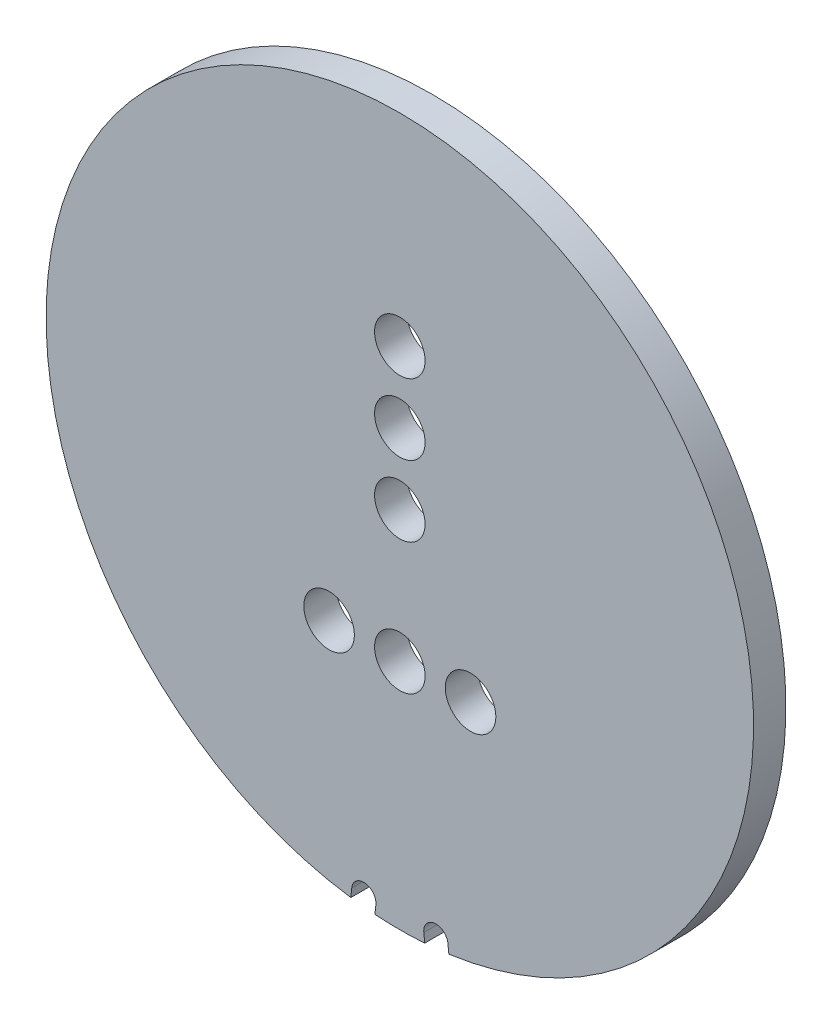
ISO-10303-21;
HEADER;
FILE_DESCRIPTION(('STEP AP214'),'2;1');
FILE_NAME('part.step','',(''),(''),'','','');
FILE_SCHEMA(('AUTOMOTIVE_DESIGN { 1 0 10303 214 1 1 1 1 }'));
ENDSEC;
DATA;
#1=APPLICATION_CONTEXT('core data for automotive mechanical design processes');
#2=APPLICATION_PROTOCOL_DEFINITION('international standard','automotive_design',2000,#1);
#3=PRODUCT_CONTEXT('',#1,'mechanical');
#4=PRODUCT('Part','Part','',(#3));
#5=PRODUCT_RELATED_PRODUCT_CATEGORY('part','',(#4));
#6=PRODUCT_DEFINITION_FORMATION('','',#4);
#7=PRODUCT_DEFINITION_CONTEXT('part definition',#1,'design');
#8=PRODUCT_DEFINITION('design','',#6,#7);
#9=PRODUCT_DEFINITION_SHAPE('','',#8);
#10=(LENGTH_UNIT() NAMED_UNIT(*) SI_UNIT(.MILLI.,.METRE.));
#11=(NAMED_UNIT(*) PLANE_ANGLE_UNIT() SI_UNIT($,.RADIAN.));
#12=(NAMED_UNIT(*) SI_UNIT($,.STERADIAN.) SOLID_ANGLE_UNIT());
#13=UNCERTAINTY_MEASURE_WITH_UNIT(LENGTH_MEASURE(1.E-05),#10,'distance_accuracy_value','');
#14=(GEOMETRIC_REPRESENTATION_CONTEXT(3) GLOBAL_UNCERTAINTY_ASSIGNED_CONTEXT((#13)) GLOBAL_UNIT_ASSIGNED_CONTEXT((#10,
#11,#12)) REPRESENTATION_CONTEXT('',''));
#15=CARTESIAN_POINT('',(0.,0.,0.));
#16=DIRECTION('',(0.,0.,1.));
#17=DIRECTION('',(1.,0.,0.));
#18=AXIS2_PLACEMENT_3D('',#15,#16,#17);
#19=CARTESIAN_POINT('',(0.,0.,-932.));
#20=DIRECTION('',(0.,0.,1.));
#21=DIRECTION('',(1.,0.,0.));
#22=AXIS2_PLACEMENT_3D('',#19,#20,#21);
#23=CYLINDRICAL_SURFACE('',#22,17.5);
#24=DIRECTION('',(0.,0.,-1.));
#25=VECTOR('',#24,1.);
#26=CARTESIAN_POINT('',(2.42488577834874,-17.3311837149677,-930.4));
#27=LINE('',#26,#25);
#28=CARTESIAN_POINT('',(2.42488577834874,-17.3311837149677,-930.4));
#29=VERTEX_POINT('',#28);
#30=CARTESIAN_POINT('',(2.42488577834874,-17.3311837149677,-932.));
#31=VERTEX_POINT('',#30);
#32=EDGE_CURVE('E59',#29,#31,#27,.T.);
#33=ORIENTED_EDGE('',*,*,#32,.T.);
#34=CARTESIAN_POINT('',(0.,0.,-932.));
#35=DIRECTION('',(0.,0.,-1.));
#36=DIRECTION('',(-1.,0.,0.));
#37=AXIS2_PLACEMENT_3D('',#34,#35,#36);
#38=CIRCLE('',#37,17.5);
#39=CARTESIAN_POINT('',(-2.42488577834874,-17.3311837149677,-932.));
#40=VERTEX_POINT('',#39);
#41=EDGE_CURVE('E44',#40,#31,#38,.T.);
#42=ORIENTED_EDGE('',*,*,#41,.F.);
#43=DIRECTION('',(0.,0.,-1.));
#44=VECTOR('',#43,1.);
#45=CARTESIAN_POINT('',(-2.42488577834874,-17.3311837149677,-930.4));
#46=LINE('',#45,#44);
#47=CARTESIAN_POINT('',(-2.42488577834874,-17.3311837149677,-930.4));
#48=VERTEX_POINT('',#47);
#49=EDGE_CURVE('E132',#48,#40,#46,.T.);
#50=ORIENTED_EDGE('',*,*,#49,.F.);
#51=CARTESIAN_POINT('',(0.,0.,-930.4));
#52=DIRECTION('',(0.,0.,-1.));
#53=DIRECTION('',(-1.,0.,0.));
#54=AXIS2_PLACEMENT_3D('',#51,#52,#53);
#55=CIRCLE('',#54,17.5);
#56=EDGE_CURVE('E39',#48,#29,#55,.T.);
#57=ORIENTED_EDGE('',*,*,#56,.T.);
#58=EDGE_LOOP('',(#33,#42,#50,#57));
#59=FACE_BOUND('',#58,.T.);
#60=ADVANCED_FACE('F35',(#59),#23,.T.);
#61=CARTESIAN_POINT('',(1.23145950390682,-17.4566178708889,-932.));
#62=VERTEX_POINT('',#61);
#63=CARTESIAN_POINT('',(-1.23145950390682,-17.4566178708889,-932.));
#64=VERTEX_POINT('',#63);
#65=EDGE_CURVE('E11',#62,#64,#38,.T.);
#66=ORIENTED_EDGE('',*,*,#65,.F.);
#67=DIRECTION('',(0.,0.,-1.));
#68=VECTOR('',#67,1.);
#69=CARTESIAN_POINT('',(1.23145950390682,-17.4566178708889,-930.4));
#70=LINE('',#69,#68);
#71=CARTESIAN_POINT('',(1.23145950390682,-17.4566178708889,-930.4));
#72=VERTEX_POINT('',#71);
#73=EDGE_CURVE('E136',#72,#62,#70,.T.);
#74=ORIENTED_EDGE('',*,*,#73,.F.);
#75=CARTESIAN_POINT('',(-1.23145950390682,-17.4566178708889,-930.4));
#76=VERTEX_POINT('',#75);
#77=EDGE_CURVE('E163',#72,#76,#55,.T.);
#78=ORIENTED_EDGE('',*,*,#77,.T.);
#79=DIRECTION('',(0.,0.,-1.));
#80=VECTOR('',#79,1.);
#81=CARTESIAN_POINT('',(-1.23145950390682,-17.4566178708889,-930.4));
#82=LINE('',#81,#80);
#83=EDGE_CURVE('E158',#76,#64,#82,.T.);
#84=ORIENTED_EDGE('',*,*,#83,.T.);
#85=EDGE_LOOP('',(#66,#74,#78,#84));
#86=FACE_BOUND('',#85,.T.);
#87=ADVANCED_FACE('F37',(#86),#23,.T.);
#88=CARTESIAN_POINT('',(0.,0.,-932.));
#89=DIRECTION('',(0.,0.,-1.));
#90=DIRECTION('',(-1.,0.,0.));
#91=AXIS2_PLACEMENT_3D('',#88,#89,#90);
#92=PLANE('',#91);
#93=CARTESIAN_POINT('',(0.,7.5,-932.));
#94=DIRECTION('',(0.,0.,1.));
#95=DIRECTION('',(1.,0.,0.));
#96=AXIS2_PLACEMENT_3D('',#93,#94,#95);
#97=CIRCLE('',#96,1.25);
#98=CARTESIAN_POINT('',(1.25,7.5,-932.));
#99=VERTEX_POINT('',#98);
#100=EDGE_CURVE('E153',#99,#99,#97,.T.);
#101=ORIENTED_EDGE('',*,*,#100,.T.);
#102=EDGE_LOOP('',(#101));
#103=FACE_BOUND('',#102,.T.);
#104=CARTESIAN_POINT('',(0.,4.,-932.));
#105=DIRECTION('',(0.,0.,1.));
#106=DIRECTION('',(1.,0.,0.));
#107=AXIS2_PLACEMENT_3D('',#104,#105,#106);
#108=CIRCLE('',#107,1.25);
#109=CARTESIAN_POINT('',(1.24999999999999,4.,-932.));
#110=VERTEX_POINT('',#109);
#111=EDGE_CURVE('E241',#110,#110,#108,.T.);
#112=ORIENTED_EDGE('',*,*,#111,.T.);
#113=EDGE_LOOP('',(#112));
#114=FACE_BOUND('',#113,.T.);
#115=CARTESIAN_POINT('',(0.,0.5,-932.));
#116=DIRECTION('',(0.,0.,1.));
#117=DIRECTION('',(1.,0.,0.));
#118=AXIS2_PLACEMENT_3D('',#115,#116,#117);
#119=CIRCLE('',#118,1.25);
#120=CARTESIAN_POINT('',(1.25,0.5,-932.));
#121=VERTEX_POINT('',#120);
#122=EDGE_CURVE('E250',#121,#121,#119,.T.);
#123=ORIENTED_EDGE('',*,*,#122,.T.);
#124=EDGE_LOOP('',(#123));
#125=FACE_BOUND('',#124,.T.);
#126=CARTESIAN_POINT('',(-3.5,-5.99999999999999,-932.));
#127=DIRECTION('',(0.,0.,1.));
#128=DIRECTION('',(1.,0.,0.));
#129=AXIS2_PLACEMENT_3D('',#126,#127,#128);
#130=CIRCLE('',#129,1.25);
#131=CARTESIAN_POINT('',(-2.25,-5.99999999999999,-932.));
#132=VERTEX_POINT('',#131);
#133=EDGE_CURVE('E256',#132,#132,#130,.T.);
#134=ORIENTED_EDGE('',*,*,#133,.T.);
#135=EDGE_LOOP('',(#134));
#136=FACE_BOUND('',#135,.T.);
#137=CARTESIAN_POINT('',(0.,-5.99999999999998,-932.));
#138=DIRECTION('',(0.,0.,1.));
#139=DIRECTION('',(1.,0.,0.));
#140=AXIS2_PLACEMENT_3D('',#137,#138,#139);
#141=CIRCLE('',#140,1.25);
#142=CARTESIAN_POINT('',(1.25,-5.99999999999998,-932.));
#143=VERTEX_POINT('',#142);
#144=EDGE_CURVE('E262',#143,#143,#141,.T.);
#145=ORIENTED_EDGE('',*,*,#144,.T.);
#146=EDGE_LOOP('',(#145));
#147=FACE_BOUND('',#146,.T.);
#148=CARTESIAN_POINT('',(3.5,-5.99999999999999,-932.));
#149=DIRECTION('',(0.,0.,1.));
#150=DIRECTION('',(1.,0.,0.));
#151=AXIS2_PLACEMENT_3D('',#148,#149,#150);
#152=CIRCLE('',#151,1.25);
#153=CARTESIAN_POINT('',(4.75,-5.99999999999999,-932.));
#154=VERTEX_POINT('',#153);
#155=EDGE_CURVE('E267',#154,#154,#152,.T.);
#156=ORIENTED_EDGE('',*,*,#155,.T.);
#157=EDGE_LOOP('',(#156));
#158=FACE_BOUND('',#157,.T.);
#159=DIRECTION('',(-0.104528463267653,0.994521895368273,0.));
#160=VECTOR('',#159,1.);
#161=CARTESIAN_POINT('',(-0.596713137220949,-0.0627170779605902,-932.));
#162=LINE('',#161,#160);
#163=CARTESIAN_POINT('',(1.18549716149254,-17.0193153939897,-932.));
#164=VERTEX_POINT('',#163);
#165=EDGE_CURVE('E121',#62,#164,#162,.T.);
#166=ORIENTED_EDGE('',*,*,#165,.F.);
#167=ORIENTED_EDGE('',*,*,#65,.T.);
#168=DIRECTION('',(0.104528463267653,0.994521895368273,0.));
#169=VECTOR('',#168,1.);
#170=CARTESIAN_POINT('',(0.596713137220949,-0.0627170779605902,-932.));
#171=LINE('',#170,#169);
#172=CARTESIAN_POINT('',(-1.18549716149254,-17.0193153939897,-932.));
#173=VERTEX_POINT('',#172);
#174=EDGE_CURVE('E143',#64,#173,#171,.T.);
#175=ORIENTED_EDGE('',*,*,#174,.T.);
#176=CARTESIAN_POINT('',(-1.7822102987135,-16.9565983160291,-932.));
#177=DIRECTION('',(0.,0.,-1.));
#178=DIRECTION('',(-1.,0.,0.));
#179=AXIS2_PLACEMENT_3D('',#176,#177,#178);
#180=CIRCLE('',#179,0.599999999999996);
#181=CARTESIAN_POINT('',(-2.37892343593446,-16.8938812380685,-932.));
#182=VERTEX_POINT('',#181);
#183=EDGE_CURVE('E152',#182,#173,#180,.T.);
#184=ORIENTED_EDGE('',*,*,#183,.F.);
#185=DIRECTION('',(0.104528463267654,0.994521895368273,0.));
#186=VECTOR('',#185,1.);
#187=CARTESIAN_POINT('',(-0.596713137220963,0.062717077960592,-932.));
#188=LINE('',#187,#186);
#189=EDGE_CURVE('E149',#40,#182,#188,.T.);
#190=ORIENTED_EDGE('',*,*,#189,.F.);
#191=ORIENTED_EDGE('',*,*,#41,.T.);
#192=DIRECTION('',(-0.104528463267654,0.994521895368273,0.));
#193=VECTOR('',#192,1.);
#194=CARTESIAN_POINT('',(0.596713137220963,0.062717077960592,-932.));
#195=LINE('',#194,#193);
#196=CARTESIAN_POINT('',(2.37892343593446,-16.8938812380685,-932.));
#197=VERTEX_POINT('',#196);
#198=EDGE_CURVE('E124',#31,#197,#195,.T.);
#199=ORIENTED_EDGE('',*,*,#198,.T.);
#200=CARTESIAN_POINT('',(1.7822102987135,-16.9565983160291,-932.));
#201=DIRECTION('',(0.,0.,-1.));
#202=DIRECTION('',(-1.,0.,0.));
#203=AXIS2_PLACEMENT_3D('',#200,#201,#202);
#204=CIRCLE('',#203,0.599999999999996);
#205=EDGE_CURVE('E115',#197,#164,#204,.F.);
#206=ORIENTED_EDGE('',*,*,#205,.T.);
#207=EDGE_LOOP('',(#166,#167,#175,#184,#190,#191,#199,#206));
#208=FACE_BOUND('',#207,.T.);
#209=ADVANCED_FACE('F193',(#103,#114,#125,#136,#147,#158,#208),#92,.T.);
#210=CARTESIAN_POINT('',(0.,0.,-930.4));
#211=DIRECTION('',(0.,0.,-1.));
#212=DIRECTION('',(-1.,0.,0.));
#213=AXIS2_PLACEMENT_3D('',#210,#211,#212);
#214=PLANE('',#213);
#215=CARTESIAN_POINT('',(0.,7.5,-930.4));
#216=DIRECTION('',(0.,0.,1.));
#217=DIRECTION('',(1.,0.,0.));
#218=AXIS2_PLACEMENT_3D('',#215,#216,#217);
#219=CIRCLE('',#218,1.25);
#220=CARTESIAN_POINT('',(1.25,7.5,-930.4));
#221=VERTEX_POINT('',#220);
#222=EDGE_CURVE('E239',#221,#221,#219,.T.);
#223=ORIENTED_EDGE('',*,*,#222,.F.);
#224=EDGE_LOOP('',(#223));
#225=FACE_BOUND('',#224,.T.);
#226=CARTESIAN_POINT('',(0.,4.,-930.4));
#227=DIRECTION('',(0.,0.,1.));
#228=DIRECTION('',(1.,0.,0.));
#229=AXIS2_PLACEMENT_3D('',#226,#227,#228);
#230=CIRCLE('',#229,1.25);
#231=CARTESIAN_POINT('',(1.24999999999999,4.,-930.4));
#232=VERTEX_POINT('',#231);
#233=EDGE_CURVE('E245',#232,#232,#230,.T.);
#234=ORIENTED_EDGE('',*,*,#233,.F.);
#235=EDGE_LOOP('',(#234));
#236=FACE_BOUND('',#235,.T.);
#237=CARTESIAN_POINT('',(0.,0.5,-930.4));
#238=DIRECTION('',(0.,0.,1.));
#239=DIRECTION('',(1.,0.,0.));
#240=AXIS2_PLACEMENT_3D('',#237,#238,#239);
#241=CIRCLE('',#240,1.25);
#242=CARTESIAN_POINT('',(1.25,0.5,-930.4));
#243=VERTEX_POINT('',#242);
#244=EDGE_CURVE('E253',#243,#243,#241,.T.);
#245=ORIENTED_EDGE('',*,*,#244,.F.);
#246=EDGE_LOOP('',(#245));
#247=FACE_BOUND('',#246,.T.);
#248=CARTESIAN_POINT('',(-3.5,-5.99999999999999,-930.4));
#249=DIRECTION('',(0.,0.,1.));
#250=DIRECTION('',(1.,0.,0.));
#251=AXIS2_PLACEMENT_3D('',#248,#249,#250);
#252=CIRCLE('',#251,1.25);
#253=CARTESIAN_POINT('',(-2.25,-5.99999999999999,-930.4));
#254=VERTEX_POINT('',#253);
#255=EDGE_CURVE('E259',#254,#254,#252,.T.);
#256=ORIENTED_EDGE('',*,*,#255,.F.);
#257=EDGE_LOOP('',(#256));
#258=FACE_BOUND('',#257,.T.);
#259=CARTESIAN_POINT('',(0.,-5.99999999999998,-930.4));
#260=DIRECTION('',(0.,0.,1.));
#261=DIRECTION('',(1.,0.,0.));
#262=AXIS2_PLACEMENT_3D('',#259,#260,#261);
#263=CIRCLE('',#262,1.25);
#264=CARTESIAN_POINT('',(1.25,-5.99999999999998,-930.4));
#265=VERTEX_POINT('',#264);
#266=EDGE_CURVE('E265',#265,#265,#263,.T.);
#267=ORIENTED_EDGE('',*,*,#266,.F.);
#268=EDGE_LOOP('',(#267));
#269=FACE_BOUND('',#268,.T.);
#270=CARTESIAN_POINT('',(3.5,-5.99999999999999,-930.4));
#271=DIRECTION('',(0.,0.,1.));
#272=DIRECTION('',(1.,0.,0.));
#273=AXIS2_PLACEMENT_3D('',#270,#271,#272);
#274=CIRCLE('',#273,1.25);
#275=CARTESIAN_POINT('',(4.75,-5.99999999999999,-930.4));
#276=VERTEX_POINT('',#275);
#277=EDGE_CURVE('E127',#276,#276,#274,.T.);
#278=ORIENTED_EDGE('',*,*,#277,.F.);
#279=EDGE_LOOP('',(#278));
#280=FACE_BOUND('',#279,.T.);
#281=ORIENTED_EDGE('',*,*,#77,.F.);
#282=DIRECTION('',(-0.104528463267653,0.994521895368273,0.));
#283=VECTOR('',#282,1.);
#284=CARTESIAN_POINT('',(-0.596713137220949,-0.0627170779605902,-930.4));
#285=LINE('',#284,#283);
#286=CARTESIAN_POINT('',(1.18549716149254,-17.0193153939897,-930.4));
#287=VERTEX_POINT('',#286);
#288=EDGE_CURVE('E108',#72,#287,#285,.T.);
#289=ORIENTED_EDGE('',*,*,#288,.T.);
#290=CARTESIAN_POINT('',(1.7822102987135,-16.9565983160291,-930.4));
#291=DIRECTION('',(0.,0.,-1.));
#292=DIRECTION('',(-1.,0.,0.));
#293=AXIS2_PLACEMENT_3D('',#290,#291,#292);
#294=CIRCLE('',#293,0.599999999999996);
#295=CARTESIAN_POINT('',(2.37892343593446,-16.8938812380685,-930.4));
#296=VERTEX_POINT('',#295);
#297=EDGE_CURVE('E109',#296,#287,#294,.F.);
#298=ORIENTED_EDGE('',*,*,#297,.F.);
#299=DIRECTION('',(-0.104528463267654,0.994521895368273,0.));
#300=VECTOR('',#299,1.);
#301=CARTESIAN_POINT('',(0.596713137220963,0.062717077960592,-930.4));
#302=LINE('',#301,#300);
#303=EDGE_CURVE('E99',#29,#296,#302,.T.);
#304=ORIENTED_EDGE('',*,*,#303,.F.);
#305=ORIENTED_EDGE('',*,*,#56,.F.);
#306=DIRECTION('',(0.104528463267654,0.994521895368273,0.));
#307=VECTOR('',#306,1.);
#308=CARTESIAN_POINT('',(-0.596713137220963,0.062717077960592,-930.4));
#309=LINE('',#308,#307);
#310=CARTESIAN_POINT('',(-2.37892343593446,-16.8938812380685,-930.4));
#311=VERTEX_POINT('',#310);
#312=EDGE_CURVE('E139',#48,#311,#309,.T.);
#313=ORIENTED_EDGE('',*,*,#312,.T.);
#314=CARTESIAN_POINT('',(-1.7822102987135,-16.9565983160291,-930.4));
#315=DIRECTION('',(0.,0.,-1.));
#316=DIRECTION('',(-1.,0.,0.));
#317=AXIS2_PLACEMENT_3D('',#314,#315,#316);
#318=CIRCLE('',#317,0.599999999999996);
#319=CARTESIAN_POINT('',(-1.18549716149254,-17.0193153939897,-930.4));
#320=VERTEX_POINT('',#319);
#321=EDGE_CURVE('E142',#311,#320,#318,.T.);
#322=ORIENTED_EDGE('',*,*,#321,.T.);
#323=DIRECTION('',(0.104528463267653,0.994521895368273,0.));
#324=VECTOR('',#323,1.);
#325=CARTESIAN_POINT('',(0.596713137220949,-0.0627170779605902,-930.4));
#326=LINE('',#325,#324);
#327=EDGE_CURVE('E146',#76,#320,#326,.T.);
#328=ORIENTED_EDGE('',*,*,#327,.F.);
#329=EDGE_LOOP('',(#281,#289,#298,#304,#305,#313,#322,#328));
#330=FACE_BOUND('',#329,.T.);
#331=ADVANCED_FACE('F120',(#225,#236,#247,#258,#269,#280,#330),#214,.F.);
#332=CARTESIAN_POINT('',(-0.596713137220963,0.062717077960592,-930.4));
#333=DIRECTION('',(-0.994521895368273,0.104528463267654,0.));
#334=DIRECTION('',(-0.104528463267654,-0.994521895368273,0.));
#335=AXIS2_PLACEMENT_3D('',#332,#333,#334);
#336=PLANE('',#335);
#337=ORIENTED_EDGE('',*,*,#189,.T.);
#338=DIRECTION('',(0.,0.,-1.));
#339=VECTOR('',#338,1.);
#340=CARTESIAN_POINT('',(-2.37892343593446,-16.8938812380685,-930.4));
#341=LINE('',#340,#339);
#342=EDGE_CURVE('E148',#311,#182,#341,.T.);
#343=ORIENTED_EDGE('',*,*,#342,.F.);
#344=ORIENTED_EDGE('',*,*,#312,.F.);
#345=ORIENTED_EDGE('',*,*,#49,.T.);
#346=EDGE_LOOP('',(#337,#343,#344,#345));
#347=FACE_BOUND('',#346,.T.);
#348=ADVANCED_FACE('F174',(#347),#336,.F.);
#349=CARTESIAN_POINT('',(0.596713137220949,-0.0627170779605902,-930.4));
#350=DIRECTION('',(-0.994521895368273,0.104528463267653,0.));
#351=DIRECTION('',(-0.104528463267653,-0.994521895368273,0.));
#352=AXIS2_PLACEMENT_3D('',#349,#350,#351);
#353=PLANE('',#352);
#354=ORIENTED_EDGE('',*,*,#174,.F.);
#355=ORIENTED_EDGE('',*,*,#83,.F.);
#356=ORIENTED_EDGE('',*,*,#327,.T.);
#357=DIRECTION('',(0.,0.,-1.));
#358=VECTOR('',#357,1.);
#359=CARTESIAN_POINT('',(-1.18549716149254,-17.0193153939897,-930.4));
#360=LINE('',#359,#358);
#361=EDGE_CURVE('E51',#320,#173,#360,.T.);
#362=ORIENTED_EDGE('',*,*,#361,.T.);
#363=EDGE_LOOP('',(#354,#355,#356,#362));
#364=FACE_BOUND('',#363,.T.);
#365=ADVANCED_FACE('F178',(#364),#353,.T.);
#366=CARTESIAN_POINT('',(-1.7822102987135,-16.9565983160291,-930.4));
#367=DIRECTION('',(0.,0.,-1.));
#368=DIRECTION('',(-1.,0.,0.));
#369=AXIS2_PLACEMENT_3D('',#366,#367,#368);
#370=CYLINDRICAL_SURFACE('',#369,0.599999999999996);
#371=ORIENTED_EDGE('',*,*,#183,.T.);
#372=ORIENTED_EDGE('',*,*,#361,.F.);
#373=ORIENTED_EDGE('',*,*,#321,.F.);
#374=ORIENTED_EDGE('',*,*,#342,.T.);
#375=EDGE_LOOP('',(#371,#372,#373,#374));
#376=FACE_BOUND('',#375,.T.);
#377=ADVANCED_FACE('F176',(#376),#370,.F.);
#378=CARTESIAN_POINT('',(1.7822102987135,-16.9565983160291,-930.4));
#379=DIRECTION('',(0.,0.,-1.));
#380=DIRECTION('',(-1.,0.,0.));
#381=AXIS2_PLACEMENT_3D('',#378,#379,#380);
#382=CYLINDRICAL_SURFACE('',#381,0.599999999999996);
#383=ORIENTED_EDGE('',*,*,#205,.F.);
#384=DIRECTION('',(0.,0.,-1.));
#385=VECTOR('',#384,1.);
#386=CARTESIAN_POINT('',(2.37892343593446,-16.8938812380685,-930.4));
#387=LINE('',#386,#385);
#388=EDGE_CURVE('E102',#296,#197,#387,.T.);
#389=ORIENTED_EDGE('',*,*,#388,.F.);
#390=ORIENTED_EDGE('',*,*,#297,.T.);
#391=DIRECTION('',(0.,0.,-1.));
#392=VECTOR('',#391,1.);
#393=CARTESIAN_POINT('',(1.18549716149254,-17.0193153939897,-930.4));
#394=LINE('',#393,#392);
#395=EDGE_CURVE('E134',#287,#164,#394,.T.);
#396=ORIENTED_EDGE('',*,*,#395,.T.);
#397=EDGE_LOOP('',(#383,#389,#390,#396));
#398=FACE_BOUND('',#397,.T.);
#399=ADVANCED_FACE('F112',(#398),#382,.F.);
#400=CARTESIAN_POINT('',(-0.596713137220949,-0.0627170779605902,-930.4));
#401=DIRECTION('',(-0.994521895368273,-0.104528463267653,0.));
#402=DIRECTION('',(0.104528463267653,-0.994521895368273,0.));
#403=AXIS2_PLACEMENT_3D('',#400,#401,#402);
#404=PLANE('',#403);
#405=ORIENTED_EDGE('',*,*,#165,.T.);
#406=ORIENTED_EDGE('',*,*,#395,.F.);
#407=ORIENTED_EDGE('',*,*,#288,.F.);
#408=ORIENTED_EDGE('',*,*,#73,.T.);
#409=EDGE_LOOP('',(#405,#406,#407,#408));
#410=FACE_BOUND('',#409,.T.);
#411=ADVANCED_FACE('F184',(#410),#404,.F.);
#412=CARTESIAN_POINT('',(0.596713137220963,0.062717077960592,-930.4));
#413=DIRECTION('',(-0.994521895368273,-0.104528463267654,0.));
#414=DIRECTION('',(0.104528463267654,-0.994521895368273,0.));
#415=AXIS2_PLACEMENT_3D('',#412,#413,#414);
#416=PLANE('',#415);
#417=ORIENTED_EDGE('',*,*,#198,.F.);
#418=ORIENTED_EDGE('',*,*,#32,.F.);
#419=ORIENTED_EDGE('',*,*,#303,.T.);
#420=ORIENTED_EDGE('',*,*,#388,.T.);
#421=EDGE_LOOP('',(#417,#418,#419,#420));
#422=FACE_BOUND('',#421,.T.);
#423=ADVANCED_FACE('F101',(#422),#416,.T.);
#424=CARTESIAN_POINT('',(3.5,-5.99999999999999,-932.));
#425=DIRECTION('',(0.,0.,1.));
#426=DIRECTION('',(1.,0.,0.));
#427=AXIS2_PLACEMENT_3D('',#424,#425,#426);
#428=CYLINDRICAL_SURFACE('',#427,1.25);
#429=ORIENTED_EDGE('',*,*,#155,.F.);
#430=EDGE_LOOP('',(#429));
#431=FACE_BOUND('',#430,.T.);
#432=ORIENTED_EDGE('',*,*,#277,.T.);
#433=EDGE_LOOP('',(#432));
#434=FACE_BOUND('',#433,.T.);
#435=ADVANCED_FACE('F207',(#431,#434),#428,.F.);
#436=CARTESIAN_POINT('',(0.,-5.99999999999998,-932.));
#437=DIRECTION('',(0.,0.,1.));
#438=DIRECTION('',(1.,0.,0.));
#439=AXIS2_PLACEMENT_3D('',#436,#437,#438);
#440=CYLINDRICAL_SURFACE('',#439,1.25);
#441=ORIENTED_EDGE('',*,*,#144,.F.);
#442=EDGE_LOOP('',(#441));
#443=FACE_BOUND('',#442,.T.);
#444=ORIENTED_EDGE('',*,*,#266,.T.);
#445=EDGE_LOOP('',(#444));
#446=FACE_BOUND('',#445,.T.);
#447=ADVANCED_FACE('F212',(#443,#446),#440,.F.);
#448=CARTESIAN_POINT('',(-3.5,-5.99999999999999,-932.));
#449=DIRECTION('',(0.,0.,1.));
#450=DIRECTION('',(1.,0.,0.));
#451=AXIS2_PLACEMENT_3D('',#448,#449,#450);
#452=CYLINDRICAL_SURFACE('',#451,1.25);
#453=ORIENTED_EDGE('',*,*,#133,.F.);
#454=EDGE_LOOP('',(#453));
#455=FACE_BOUND('',#454,.T.);
#456=ORIENTED_EDGE('',*,*,#255,.T.);
#457=EDGE_LOOP('',(#456));
#458=FACE_BOUND('',#457,.T.);
#459=ADVANCED_FACE('F216',(#455,#458),#452,.F.);
#460=CARTESIAN_POINT('',(0.,0.5,-932.));
#461=DIRECTION('',(0.,0.,1.));
#462=DIRECTION('',(1.,0.,0.));
#463=AXIS2_PLACEMENT_3D('',#460,#461,#462);
#464=CYLINDRICAL_SURFACE('',#463,1.25);
#465=ORIENTED_EDGE('',*,*,#122,.F.);
#466=EDGE_LOOP('',(#465));
#467=FACE_BOUND('',#466,.T.);
#468=ORIENTED_EDGE('',*,*,#244,.T.);
#469=EDGE_LOOP('',(#468));
#470=FACE_BOUND('',#469,.T.);
#471=ADVANCED_FACE('F220',(#467,#470),#464,.F.);
#472=CARTESIAN_POINT('',(0.,4.,-932.));
#473=DIRECTION('',(0.,0.,1.));
#474=DIRECTION('',(1.,0.,0.));
#475=AXIS2_PLACEMENT_3D('',#472,#473,#474);
#476=CYLINDRICAL_SURFACE('',#475,1.25);
#477=ORIENTED_EDGE('',*,*,#111,.F.);
#478=EDGE_LOOP('',(#477));
#479=FACE_BOUND('',#478,.T.);
#480=ORIENTED_EDGE('',*,*,#233,.T.);
#481=EDGE_LOOP('',(#480));
#482=FACE_BOUND('',#481,.T.);
#483=ADVANCED_FACE('F224',(#479,#482),#476,.F.);
#484=CARTESIAN_POINT('',(0.,7.5,-932.));
#485=DIRECTION('',(0.,0.,1.));
#486=DIRECTION('',(1.,0.,0.));
#487=AXIS2_PLACEMENT_3D('',#484,#485,#486);
#488=CYLINDRICAL_SURFACE('',#487,1.25);
#489=ORIENTED_EDGE('',*,*,#100,.F.);
#490=EDGE_LOOP('',(#489));
#491=FACE_BOUND('',#490,.T.);
#492=ORIENTED_EDGE('',*,*,#222,.T.);
#493=EDGE_LOOP('',(#492));
#494=FACE_BOUND('',#493,.T.);
#495=ADVANCED_FACE('F228',(#491,#494),#488,.F.);
#496=CLOSED_SHELL('',(#60,#87,#209,#331,#348,#365,#377,#399,#411,#423,#435,#447,#459,#471,#483,#495));
#497=MANIFOLD_SOLID_BREP('B2',#496);
#498=ADVANCED_BREP_SHAPE_REPRESENTATION('',(#18,#497),#14);
#499=SHAPE_DEFINITION_REPRESENTATION(#9,#498);
ENDSEC;
END-ISO-10303-21;
